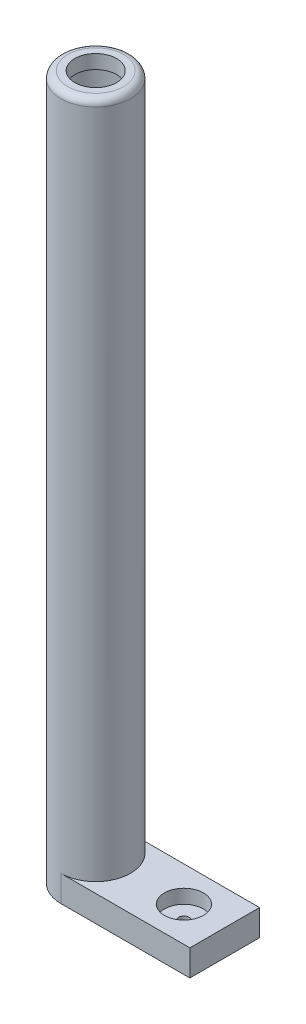
ISO-10303-21;
HEADER;
FILE_DESCRIPTION(('STEP AP214'),'2;1');
FILE_NAME('part.step','',(''),(''),'','','');
FILE_SCHEMA(('AUTOMOTIVE_DESIGN { 1 0 10303 214 1 1 1 1 }'));
ENDSEC;
DATA;
#1=APPLICATION_CONTEXT('core data for automotive mechanical design processes');
#2=APPLICATION_PROTOCOL_DEFINITION('international standard','automotive_design',2000,#1);
#3=PRODUCT_CONTEXT('',#1,'mechanical');
#4=PRODUCT('Part','Part','',(#3));
#5=PRODUCT_RELATED_PRODUCT_CATEGORY('part','',(#4));
#6=PRODUCT_DEFINITION_FORMATION('','',#4);
#7=PRODUCT_DEFINITION_CONTEXT('part definition',#1,'design');
#8=PRODUCT_DEFINITION('design','',#6,#7);
#9=PRODUCT_DEFINITION_SHAPE('','',#8);
#10=(LENGTH_UNIT() NAMED_UNIT(*) SI_UNIT(.MILLI.,.METRE.));
#11=(NAMED_UNIT(*) PLANE_ANGLE_UNIT() SI_UNIT($,.RADIAN.));
#12=(NAMED_UNIT(*) SI_UNIT($,.STERADIAN.) SOLID_ANGLE_UNIT());
#13=UNCERTAINTY_MEASURE_WITH_UNIT(LENGTH_MEASURE(1.E-05),#10,'distance_accuracy_value','');
#14=(GEOMETRIC_REPRESENTATION_CONTEXT(3) GLOBAL_UNCERTAINTY_ASSIGNED_CONTEXT((#13)) GLOBAL_UNIT_ASSIGNED_CONTEXT((#10,
#11,#12)) REPRESENTATION_CONTEXT('',''));
#15=CARTESIAN_POINT('',(0.,0.,0.));
#16=DIRECTION('',(0.,0.,1.));
#17=DIRECTION('',(1.,0.,0.));
#18=AXIS2_PLACEMENT_3D('',#15,#16,#17);
#19=CARTESIAN_POINT('',(4.26160516543305,687.81422078496,-2.80637319245238E-05));
#20=DIRECTION('',(0.,-1.,0.));
#21=DIRECTION('',(0.,0.,-1.));
#22=AXIS2_PLACEMENT_3D('',#19,#20,#21);
#23=CYLINDRICAL_SURFACE('',#22,20.);
#24=CARTESIAN_POINT('',(4.26160516543305,683.81422078496,-2.80637319245238E-05));
#25=DIRECTION('',(0.,1.,0.));
#26=DIRECTION('',(0.,0.,1.));
#27=AXIS2_PLACEMENT_3D('',#24,#25,#26);
#28=CIRCLE('',#27,20.);
#29=CARTESIAN_POINT('',(4.26160516543305,683.81422078496,19.9999719362681));
#30=VERTEX_POINT('',#29);
#31=EDGE_CURVE('E56',#30,#30,#28,.F.);
#32=ORIENTED_EDGE('',*,*,#31,.T.);
#33=EDGE_LOOP('',(#32));
#34=FACE_BOUND('',#33,.T.);
#35=DIRECTION('',(0.,-1.,0.));
#36=VECTOR('',#35,1.);
#37=CARTESIAN_POINT('',(4.26160516543305,298.81422078496,19.9999719362681));
#38=LINE('',#37,#36);
#39=CARTESIAN_POINT('',(4.26160516543305,298.81422078496,19.9999719362681));
#40=VERTEX_POINT('',#39);
#41=CARTESIAN_POINT('',(4.26160516543305,283.81422078496,19.9999719362681));
#42=VERTEX_POINT('',#41);
#43=EDGE_CURVE('E63',#40,#42,#38,.T.);
#44=ORIENTED_EDGE('',*,*,#43,.F.);
#45=CARTESIAN_POINT('',(4.26160516543305,298.81422078496,-2.80637319245238E-05));
#46=DIRECTION('',(0.,-1.,0.));
#47=DIRECTION('',(0.,0.,-1.));
#48=AXIS2_PLACEMENT_3D('',#45,#46,#47);
#49=CIRCLE('',#48,20.);
#50=CARTESIAN_POINT('',(4.26160516543305,298.81422078496,-20.0000280637319));
#51=VERTEX_POINT('',#50);
#52=EDGE_CURVE('E68',#51,#40,#49,.T.);
#53=ORIENTED_EDGE('',*,*,#52,.F.);
#54=DIRECTION('',(0.,-1.,0.));
#55=VECTOR('',#54,1.);
#56=CARTESIAN_POINT('',(4.26160516543305,298.81422078496,-20.0000280637319));
#57=LINE('',#56,#55);
#58=CARTESIAN_POINT('',(4.26160516543305,283.81422078496,-20.0000280637319));
#59=VERTEX_POINT('',#58);
#60=EDGE_CURVE('E109',#51,#59,#57,.T.);
#61=ORIENTED_EDGE('',*,*,#60,.T.);
#62=CARTESIAN_POINT('',(4.26160516543305,283.81422078496,-2.80637319245238E-05));
#63=DIRECTION('',(0.,1.,0.));
#64=DIRECTION('',(0.,0.,1.));
#65=AXIS2_PLACEMENT_3D('',#62,#63,#64);
#66=CIRCLE('',#65,20.);
#67=EDGE_CURVE('E159',#59,#42,#66,.T.);
#68=ORIENTED_EDGE('',*,*,#67,.T.);
#69=EDGE_LOOP('',(#44,#53,#61,#68));
#70=FACE_BOUND('',#69,.T.);
#71=ADVANCED_FACE('F47',(#34,#70),#23,.T.);
#72=CARTESIAN_POINT('',(4.26160516543305,283.81422078496,-2.80637319245238E-05));
#73=DIRECTION('',(0.,1.,0.));
#74=DIRECTION('',(0.,0.,1.));
#75=AXIS2_PLACEMENT_3D('',#72,#73,#74);
#76=PLANE('',#75);
#77=CARTESIAN_POINT('',(29.5778932410782,283.81422078496,-1.40318659622619E-05));
#78=DIRECTION('',(0.,1.,0.));
#79=DIRECTION('',(0.,0.,1.));
#80=AXIS2_PLACEMENT_3D('',#77,#78,#79);
#81=CIRCLE('',#80,1.18812162288793);
#82=CARTESIAN_POINT('',(29.5778932410782,283.81422078496,1.18810759102196));
#83=VERTEX_POINT('',#82);
#84=EDGE_CURVE('E11',#83,#83,#81,.F.);
#85=ORIENTED_EDGE('',*,*,#84,.F.);
#86=EDGE_LOOP('',(#85));
#87=FACE_BOUND('',#86,.T.);
#88=CARTESIAN_POINT('',(54.8941813167234,283.81422078496,0.));
#89=DIRECTION('',(0.,1.,0.));
#90=DIRECTION('',(0.,0.,1.));
#91=AXIS2_PLACEMENT_3D('',#88,#89,#90);
#92=CIRCLE('',#91,3.);
#93=CARTESIAN_POINT('',(54.8941813167234,283.81422078496,3.));
#94=VERTEX_POINT('',#93);
#95=EDGE_CURVE('E168',#94,#94,#92,.T.);
#96=ORIENTED_EDGE('',*,*,#95,.T.);
#97=EDGE_LOOP('',(#96));
#98=FACE_BOUND('',#97,.T.);
#99=ORIENTED_EDGE('',*,*,#67,.F.);
#100=DIRECTION('',(1.,0.,0.));
#101=VECTOR('',#100,1.);
#102=CARTESIAN_POINT('',(0.,283.81422078496,-20.0000280637319));
#103=LINE('',#102,#101);
#104=CARTESIAN_POINT('',(78.3005611436214,283.81422078496,-20.0000280637319));
#105=VERTEX_POINT('',#104);
#106=EDGE_CURVE('E121',#59,#105,#103,.T.);
#107=ORIENTED_EDGE('',*,*,#106,.T.);
#108=DIRECTION('',(0.,0.,-1.));
#109=VECTOR('',#108,1.);
#110=CARTESIAN_POINT('',(78.3005611436214,283.81422078496,0.));
#111=LINE('',#110,#109);
#112=CARTESIAN_POINT('',(78.3005611436214,283.81422078496,19.9999719362681));
#113=VERTEX_POINT('',#112);
#114=EDGE_CURVE('E103',#113,#105,#111,.T.);
#115=ORIENTED_EDGE('',*,*,#114,.F.);
#116=DIRECTION('',(1.,0.,0.));
#117=VECTOR('',#116,1.);
#118=CARTESIAN_POINT('',(0.,283.81422078496,19.9999719362681));
#119=LINE('',#118,#117);
#120=EDGE_CURVE('E115',#42,#113,#119,.T.);
#121=ORIENTED_EDGE('',*,*,#120,.F.);
#122=EDGE_LOOP('',(#99,#107,#115,#121));
#123=FACE_BOUND('',#122,.T.);
#124=CARTESIAN_POINT('',(4.26160516543305,283.81422078496,-2.80637319245238E-05));
#125=DIRECTION('',(0.,-1.,0.));
#126=DIRECTION('',(0.,0.,-1.));
#127=AXIS2_PLACEMENT_3D('',#124,#125,#126);
#128=CIRCLE('',#127,16.);
#129=CARTESIAN_POINT('',(4.26160516543305,283.81422078496,-16.0000280637319));
#130=VERTEX_POINT('',#129);
#131=EDGE_CURVE('E147',#130,#130,#128,.T.);
#132=ORIENTED_EDGE('',*,*,#131,.F.);
#133=EDGE_LOOP('',(#132));
#134=FACE_BOUND('',#133,.T.);
#135=ADVANCED_FACE('F207',(#87,#98,#123,#134),#76,.F.);
#136=CARTESIAN_POINT('',(4.26160516543305,687.81422078496,-2.80637319245238E-05));
#137=DIRECTION('',(0.,-1.,0.));
#138=DIRECTION('',(0.,0.,-1.));
#139=AXIS2_PLACEMENT_3D('',#136,#137,#138);
#140=CYLINDRICAL_SURFACE('',#139,18.);
#141=CARTESIAN_POINT('',(4.26160516543305,293.81422078496,-2.80637319245238E-05));
#142=DIRECTION('',(0.,-1.,0.));
#143=DIRECTION('',(0.,0.,-1.));
#144=AXIS2_PLACEMENT_3D('',#141,#142,#143);
#145=CIRCLE('',#144,18.);
#146=CARTESIAN_POINT('',(4.26160516543305,293.81422078496,-18.0000280637319));
#147=VERTEX_POINT('',#146);
#148=EDGE_CURVE('E152',#147,#147,#145,.T.);
#149=ORIENTED_EDGE('',*,*,#148,.T.);
#150=EDGE_LOOP('',(#149));
#151=FACE_BOUND('',#150,.T.);
#152=CARTESIAN_POINT('',(4.26160516543305,679.81422078496,-2.80637319245238E-05));
#153=DIRECTION('',(0.,1.,0.));
#154=DIRECTION('',(0.,0.,1.));
#155=AXIS2_PLACEMENT_3D('',#152,#153,#154);
#156=CIRCLE('',#155,18.);
#157=CARTESIAN_POINT('',(4.26160516543305,679.81422078496,17.9999719362681));
#158=VERTEX_POINT('',#157);
#159=EDGE_CURVE('E140',#158,#158,#156,.T.);
#160=ORIENTED_EDGE('',*,*,#159,.T.);
#161=EDGE_LOOP('',(#160));
#162=FACE_BOUND('',#161,.T.);
#163=ADVANCED_FACE('F213',(#151,#162),#140,.F.);
#164=CARTESIAN_POINT('',(4.26160516543305,687.81422078496,-2.80637319245238E-05));
#165=DIRECTION('',(0.,1.,0.));
#166=DIRECTION('',(0.,0.,1.));
#167=AXIS2_PLACEMENT_3D('',#164,#165,#166);
#168=PLANE('',#167);
#169=CARTESIAN_POINT('',(4.26160516543305,687.81422078496,-2.80637319245238E-05));
#170=DIRECTION('',(0.,1.,0.));
#171=DIRECTION('',(0.,0.,1.));
#172=AXIS2_PLACEMENT_3D('',#169,#170,#171);
#173=CIRCLE('',#172,16.);
#174=CARTESIAN_POINT('',(4.26160516543305,687.81422078496,15.9999719362681));
#175=VERTEX_POINT('',#174);
#176=EDGE_CURVE('E162',#175,#175,#173,.T.);
#177=ORIENTED_EDGE('',*,*,#176,.T.);
#178=EDGE_LOOP('',(#177));
#179=FACE_BOUND('',#178,.T.);
#180=CARTESIAN_POINT('',(4.26160516543305,687.81422078496,-2.80637319245238E-05));
#181=DIRECTION('',(0.,1.,0.));
#182=DIRECTION('',(0.,0.,1.));
#183=AXIS2_PLACEMENT_3D('',#180,#181,#182);
#184=CIRCLE('',#183,12.);
#185=CARTESIAN_POINT('',(4.26160516543305,687.81422078496,11.9999719362681));
#186=VERTEX_POINT('',#185);
#187=EDGE_CURVE('E131',#186,#186,#184,.T.);
#188=ORIENTED_EDGE('',*,*,#187,.F.);
#189=EDGE_LOOP('',(#188));
#190=FACE_BOUND('',#189,.T.);
#191=ADVANCED_FACE('F217',(#179,#190),#168,.T.);
#192=CARTESIAN_POINT('',(4.26160516543305,293.81422078496,-2.80637319245238E-05));
#193=DIRECTION('',(0.,-1.,0.));
#194=DIRECTION('',(0.,0.,-1.));
#195=AXIS2_PLACEMENT_3D('',#192,#193,#194);
#196=PLANE('',#195);
#197=CARTESIAN_POINT('',(4.26160516543305,293.81422078496,-2.80637319245238E-05));
#198=DIRECTION('',(0.,-1.,0.));
#199=DIRECTION('',(0.,0.,-1.));
#200=AXIS2_PLACEMENT_3D('',#197,#198,#199);
#201=CIRCLE('',#200,16.);
#202=CARTESIAN_POINT('',(4.26160516543305,293.81422078496,-16.0000280637319));
#203=VERTEX_POINT('',#202);
#204=EDGE_CURVE('E148',#203,#203,#201,.T.);
#205=ORIENTED_EDGE('',*,*,#204,.T.);
#206=EDGE_LOOP('',(#205));
#207=FACE_BOUND('',#206,.T.);
#208=ORIENTED_EDGE('',*,*,#148,.F.);
#209=EDGE_LOOP('',(#208));
#210=FACE_BOUND('',#209,.T.);
#211=ADVANCED_FACE('F220',(#207,#210),#196,.F.);
#212=CARTESIAN_POINT('',(4.26160516543305,293.81422078496,-2.80637319245238E-05));
#213=DIRECTION('',(0.,-1.,0.));
#214=DIRECTION('',(0.,0.,-1.));
#215=AXIS2_PLACEMENT_3D('',#212,#213,#214);
#216=CYLINDRICAL_SURFACE('',#215,16.);
#217=ORIENTED_EDGE('',*,*,#204,.F.);
#218=EDGE_LOOP('',(#217));
#219=FACE_BOUND('',#218,.T.);
#220=ORIENTED_EDGE('',*,*,#131,.T.);
#221=EDGE_LOOP('',(#220));
#222=FACE_BOUND('',#221,.T.);
#223=ADVANCED_FACE('F227',(#219,#222),#216,.F.);
#224=CARTESIAN_POINT('',(4.26160516543305,679.81422078496,-2.80637319245238E-05));
#225=DIRECTION('',(0.,1.,0.));
#226=DIRECTION('',(0.,0.,1.));
#227=AXIS2_PLACEMENT_3D('',#224,#225,#226);
#228=PLANE('',#227);
#229=CARTESIAN_POINT('',(4.26160516543305,679.81422078496,-2.80637319245238E-05));
#230=DIRECTION('',(0.,1.,0.));
#231=DIRECTION('',(0.,0.,1.));
#232=AXIS2_PLACEMENT_3D('',#229,#230,#231);
#233=CIRCLE('',#232,12.);
#234=CARTESIAN_POINT('',(4.26160516543305,679.81422078496,11.9999719362681));
#235=VERTEX_POINT('',#234);
#236=EDGE_CURVE('E136',#235,#235,#233,.T.);
#237=ORIENTED_EDGE('',*,*,#236,.T.);
#238=EDGE_LOOP('',(#237));
#239=FACE_BOUND('',#238,.T.);
#240=ORIENTED_EDGE('',*,*,#159,.F.);
#241=EDGE_LOOP('',(#240));
#242=FACE_BOUND('',#241,.T.);
#243=ADVANCED_FACE('F231',(#239,#242),#228,.F.);
#244=CARTESIAN_POINT('',(4.26160516543305,679.81422078496,-2.80637319245238E-05));
#245=DIRECTION('',(0.,1.,0.));
#246=DIRECTION('',(0.,0.,1.));
#247=AXIS2_PLACEMENT_3D('',#244,#245,#246);
#248=CYLINDRICAL_SURFACE('',#247,12.);
#249=ORIENTED_EDGE('',*,*,#236,.F.);
#250=EDGE_LOOP('',(#249));
#251=FACE_BOUND('',#250,.T.);
#252=ORIENTED_EDGE('',*,*,#187,.T.);
#253=EDGE_LOOP('',(#252));
#254=FACE_BOUND('',#253,.T.);
#255=ADVANCED_FACE('F235',(#251,#254),#248,.F.);
#256=CARTESIAN_POINT('',(4.26160516543305,683.81422078496,-2.80637319245238E-05));
#257=DIRECTION('',(0.,1.,0.));
#258=DIRECTION('',(0.,0.,1.));
#259=AXIS2_PLACEMENT_3D('',#256,#257,#258);
#260=TOROIDAL_SURFACE('',#259,16.,4.);
#261=ORIENTED_EDGE('',*,*,#31,.F.);
#262=EDGE_LOOP('',(#261));
#263=FACE_BOUND('',#262,.T.);
#264=ORIENTED_EDGE('',*,*,#176,.F.);
#265=EDGE_LOOP('',(#264));
#266=FACE_BOUND('',#265,.T.);
#267=ADVANCED_FACE('F49',(#263,#266),#260,.T.);
#268=CARTESIAN_POINT('',(0.,298.81422078496,19.9999719362681));
#269=DIRECTION('',(0.,0.,-1.));
#270=DIRECTION('',(-1.,0.,0.));
#271=AXIS2_PLACEMENT_3D('',#268,#269,#270);
#272=PLANE('',#271);
#273=ORIENTED_EDGE('',*,*,#120,.T.);
#274=DIRECTION('',(0.,-1.,0.));
#275=VECTOR('',#274,1.);
#276=CARTESIAN_POINT('',(78.3005611436214,298.81422078496,19.9999719362681));
#277=LINE('',#276,#275);
#278=CARTESIAN_POINT('',(78.3005611436214,298.81422078496,19.9999719362681));
#279=VERTEX_POINT('',#278);
#280=EDGE_CURVE('E108',#279,#113,#277,.T.);
#281=ORIENTED_EDGE('',*,*,#280,.F.);
#282=DIRECTION('',(1.,0.,0.));
#283=VECTOR('',#282,1.);
#284=CARTESIAN_POINT('',(0.,298.81422078496,19.9999719362681));
#285=LINE('',#284,#283);
#286=EDGE_CURVE('E93',#40,#279,#285,.T.);
#287=ORIENTED_EDGE('',*,*,#286,.F.);
#288=ORIENTED_EDGE('',*,*,#43,.T.);
#289=EDGE_LOOP('',(#273,#281,#287,#288));
#290=FACE_BOUND('',#289,.T.);
#291=ADVANCED_FACE('F241',(#290),#272,.F.);
#292=CARTESIAN_POINT('',(78.3005611436214,298.81422078496,0.));
#293=DIRECTION('',(-1.,0.,0.));
#294=DIRECTION('',(0.,0.,1.));
#295=AXIS2_PLACEMENT_3D('',#292,#293,#294);
#296=PLANE('',#295);
#297=ORIENTED_EDGE('',*,*,#114,.T.);
#298=DIRECTION('',(0.,-1.,0.));
#299=VECTOR('',#298,1.);
#300=CARTESIAN_POINT('',(78.3005611436214,298.81422078496,-20.0000280637319));
#301=LINE('',#300,#299);
#302=CARTESIAN_POINT('',(78.3005611436214,298.81422078496,-20.0000280637319));
#303=VERTEX_POINT('',#302);
#304=EDGE_CURVE('E100',#303,#105,#301,.T.);
#305=ORIENTED_EDGE('',*,*,#304,.F.);
#306=DIRECTION('',(0.,0.,-1.));
#307=VECTOR('',#306,1.);
#308=CARTESIAN_POINT('',(78.3005611436214,298.81422078496,0.));
#309=LINE('',#308,#307);
#310=EDGE_CURVE('E88',#279,#303,#309,.T.);
#311=ORIENTED_EDGE('',*,*,#310,.F.);
#312=ORIENTED_EDGE('',*,*,#280,.T.);
#313=EDGE_LOOP('',(#297,#305,#311,#312));
#314=FACE_BOUND('',#313,.T.);
#315=ADVANCED_FACE('F101',(#314),#296,.F.);
#316=CARTESIAN_POINT('',(0.,298.81422078496,-20.0000280637319));
#317=DIRECTION('',(0.,0.,-1.));
#318=DIRECTION('',(-1.,0.,0.));
#319=AXIS2_PLACEMENT_3D('',#316,#317,#318);
#320=PLANE('',#319);
#321=ORIENTED_EDGE('',*,*,#106,.F.);
#322=ORIENTED_EDGE('',*,*,#60,.F.);
#323=DIRECTION('',(1.,0.,0.));
#324=VECTOR('',#323,1.);
#325=CARTESIAN_POINT('',(0.,298.81422078496,-20.0000280637319));
#326=LINE('',#325,#324);
#327=EDGE_CURVE('E92',#51,#303,#326,.T.);
#328=ORIENTED_EDGE('',*,*,#327,.T.);
#329=ORIENTED_EDGE('',*,*,#304,.T.);
#330=EDGE_LOOP('',(#321,#322,#328,#329));
#331=FACE_BOUND('',#330,.T.);
#332=ADVANCED_FACE('F111',(#331),#320,.T.);
#333=CARTESIAN_POINT('',(0.,298.81422078496,0.));
#334=DIRECTION('',(0.,-1.,0.));
#335=DIRECTION('',(0.,0.,-1.));
#336=AXIS2_PLACEMENT_3D('',#333,#334,#335);
#337=PLANE('',#336);
#338=CARTESIAN_POINT('',(54.8941813167234,298.81422078496,0.));
#339=DIRECTION('',(0.,1.,0.));
#340=DIRECTION('',(0.,0.,1.));
#341=AXIS2_PLACEMENT_3D('',#338,#339,#340);
#342=CIRCLE('',#341,11.2);
#343=CARTESIAN_POINT('',(54.8941813167234,298.81422078496,11.2));
#344=VERTEX_POINT('',#343);
#345=EDGE_CURVE('E171',#344,#344,#342,.T.);
#346=ORIENTED_EDGE('',*,*,#345,.F.);
#347=EDGE_LOOP('',(#346));
#348=FACE_BOUND('',#347,.T.);
#349=ORIENTED_EDGE('',*,*,#52,.T.);
#350=ORIENTED_EDGE('',*,*,#286,.T.);
#351=ORIENTED_EDGE('',*,*,#310,.T.);
#352=ORIENTED_EDGE('',*,*,#327,.F.);
#353=EDGE_LOOP('',(#349,#350,#351,#352));
#354=FACE_BOUND('',#353,.T.);
#355=ADVANCED_FACE('F90',(#348,#354),#337,.F.);
#356=CARTESIAN_POINT('',(54.8941813167234,290.81422078496,0.));
#357=DIRECTION('',(0.,1.,0.));
#358=DIRECTION('',(0.,0.,1.));
#359=AXIS2_PLACEMENT_3D('',#356,#357,#358);
#360=CYLINDRICAL_SURFACE('',#359,11.2);
#361=CARTESIAN_POINT('',(54.8941813167234,290.81422078496,0.));
#362=DIRECTION('',(0.,1.,0.));
#363=DIRECTION('',(0.,0.,1.));
#364=AXIS2_PLACEMENT_3D('',#361,#362,#363);
#365=CIRCLE('',#364,11.2);
#366=CARTESIAN_POINT('',(54.8941813167234,290.81422078496,11.2));
#367=VERTEX_POINT('',#366);
#368=EDGE_CURVE('E124',#367,#367,#365,.T.);
#369=ORIENTED_EDGE('',*,*,#368,.F.);
#370=EDGE_LOOP('',(#369));
#371=FACE_BOUND('',#370,.T.);
#372=ORIENTED_EDGE('',*,*,#345,.T.);
#373=EDGE_LOOP('',(#372));
#374=FACE_BOUND('',#373,.T.);
#375=ADVANCED_FACE('F193',(#371,#374),#360,.F.);
#376=CARTESIAN_POINT('',(54.8941813167234,290.81422078496,0.));
#377=DIRECTION('',(0.,1.,0.));
#378=DIRECTION('',(0.,0.,1.));
#379=AXIS2_PLACEMENT_3D('',#376,#377,#378);
#380=PLANE('',#379);
#381=CARTESIAN_POINT('',(54.8941813167234,290.81422078496,0.));
#382=DIRECTION('',(0.,1.,0.));
#383=DIRECTION('',(0.,0.,1.));
#384=AXIS2_PLACEMENT_3D('',#381,#382,#383);
#385=CIRCLE('',#384,3.);
#386=CARTESIAN_POINT('',(54.8941813167234,290.81422078496,3.));
#387=VERTEX_POINT('',#386);
#388=EDGE_CURVE('E172',#387,#387,#385,.T.);
#389=ORIENTED_EDGE('',*,*,#388,.F.);
#390=EDGE_LOOP('',(#389));
#391=FACE_BOUND('',#390,.T.);
#392=ORIENTED_EDGE('',*,*,#368,.T.);
#393=EDGE_LOOP('',(#392));
#394=FACE_BOUND('',#393,.T.);
#395=ADVANCED_FACE('F191',(#391,#394),#380,.T.);
#396=CARTESIAN_POINT('',(54.8941813167234,282.81422078496,0.));
#397=DIRECTION('',(0.,1.,0.));
#398=DIRECTION('',(0.,0.,1.));
#399=AXIS2_PLACEMENT_3D('',#396,#397,#398);
#400=CYLINDRICAL_SURFACE('',#399,3.);
#401=ORIENTED_EDGE('',*,*,#388,.T.);
#402=EDGE_LOOP('',(#401));
#403=FACE_BOUND('',#402,.T.);
#404=ORIENTED_EDGE('',*,*,#95,.F.);
#405=EDGE_LOOP('',(#404));
#406=FACE_BOUND('',#405,.T.);
#407=ADVANCED_FACE('F307',(#403,#406),#400,.F.);
#408=CARTESIAN_POINT('',(29.5778932410782,279.81422078496,-1.40318659622619E-05));
#409=DIRECTION('',(0.,1.,0.));
#410=DIRECTION('',(0.,0.,1.));
#411=AXIS2_PLACEMENT_3D('',#408,#409,#410);
#412=CYLINDRICAL_SURFACE('',#411,1.18812162288793);
#413=ORIENTED_EDGE('',*,*,#84,.T.);
#414=EDGE_LOOP('',(#413));
#415=FACE_BOUND('',#414,.T.);
#416=CARTESIAN_POINT('',(29.5778932410782,274.81422078496,-1.40318659622619E-05));
#417=DIRECTION('',(0.,-1.,0.));
#418=DIRECTION('',(0.,0.,-1.));
#419=AXIS2_PLACEMENT_3D('',#416,#417,#418);
#420=CIRCLE('',#419,1.18812162288793);
#421=CARTESIAN_POINT('',(29.5778932410782,274.81422078496,-1.18813565475389));
#422=VERTEX_POINT('',#421);
#423=EDGE_CURVE('E179',#422,#422,#420,.T.);
#424=ORIENTED_EDGE('',*,*,#423,.F.);
#425=EDGE_LOOP('',(#424));
#426=FACE_BOUND('',#425,.T.);
#427=ADVANCED_FACE('F318',(#415,#426),#412,.T.);
#428=CARTESIAN_POINT('',(29.5778932410782,274.81422078496,-1.40318659622619E-05));
#429=DIRECTION('',(0.,-1.,0.));
#430=DIRECTION('',(0.,0.,-1.));
#431=AXIS2_PLACEMENT_3D('',#428,#429,#430);
#432=PLANE('',#431);
#433=ORIENTED_EDGE('',*,*,#423,.T.);
#434=EDGE_LOOP('',(#433));
#435=FACE_BOUND('',#434,.T.);
#436=ADVANCED_FACE('F335',(#435),#432,.T.);
#437=CLOSED_SHELL('',(#71,#135,#163,#191,#211,#223,#243,#255,#267,#291,#315,#332,#355,#375,#395,
#407,#427,#436));
#438=MANIFOLD_SOLID_BREP('B2',#437);
#439=ADVANCED_BREP_SHAPE_REPRESENTATION('',(#18,#438),#14);
#440=SHAPE_DEFINITION_REPRESENTATION(#9,#439);
ENDSEC;
END-ISO-10303-21;
